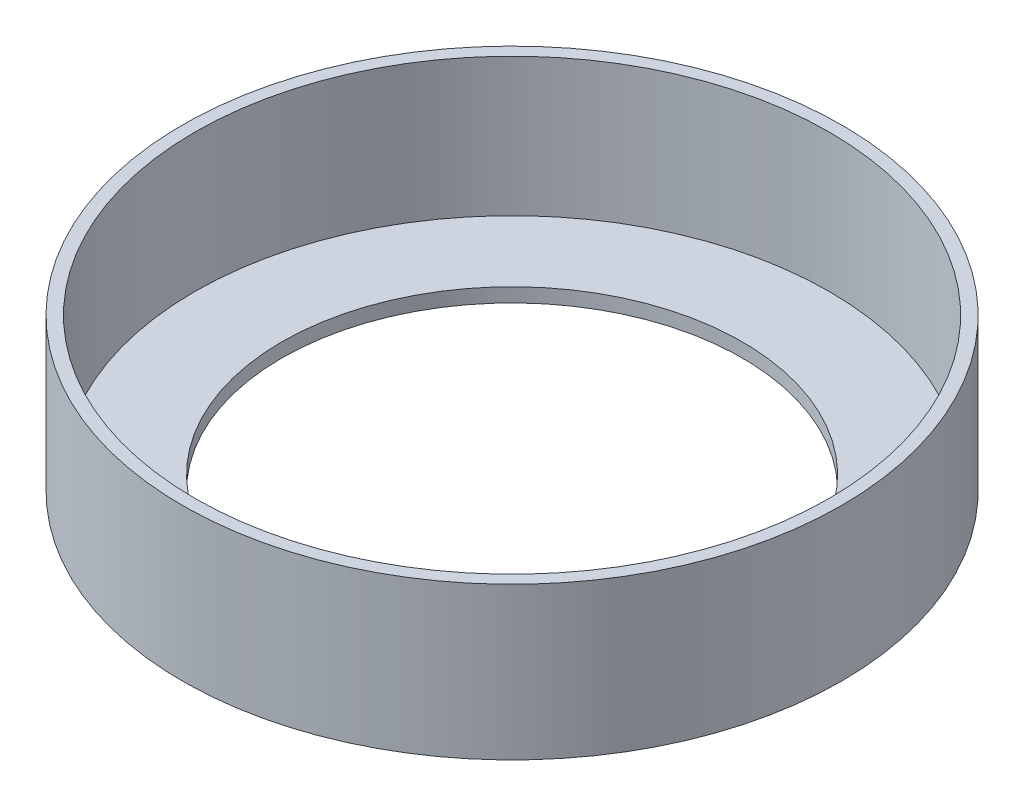
ISO-10303-21;
HEADER;
FILE_DESCRIPTION(('STEP AP214'),'2;1');
FILE_NAME('part.step','',(''),(''),'','','');
FILE_SCHEMA(('AUTOMOTIVE_DESIGN { 1 0 10303 214 1 1 1 1 }'));
ENDSEC;
DATA;
#1=APPLICATION_CONTEXT('core data for automotive mechanical design processes');
#2=APPLICATION_PROTOCOL_DEFINITION('international standard','automotive_design',2000,#1);
#3=PRODUCT_CONTEXT('',#1,'mechanical');
#4=PRODUCT('Part','Part','',(#3));
#5=PRODUCT_RELATED_PRODUCT_CATEGORY('part','',(#4));
#6=PRODUCT_DEFINITION_FORMATION('','',#4);
#7=PRODUCT_DEFINITION_CONTEXT('part definition',#1,'design');
#8=PRODUCT_DEFINITION('design','',#6,#7);
#9=PRODUCT_DEFINITION_SHAPE('','',#8);
#10=(LENGTH_UNIT() NAMED_UNIT(*) SI_UNIT(.MILLI.,.METRE.));
#11=(NAMED_UNIT(*) PLANE_ANGLE_UNIT() SI_UNIT($,.RADIAN.));
#12=(NAMED_UNIT(*) SI_UNIT($,.STERADIAN.) SOLID_ANGLE_UNIT());
#13=UNCERTAINTY_MEASURE_WITH_UNIT(LENGTH_MEASURE(1.E-05),#10,'distance_accuracy_value','');
#14=(GEOMETRIC_REPRESENTATION_CONTEXT(3) GLOBAL_UNCERTAINTY_ASSIGNED_CONTEXT((#13)) GLOBAL_UNIT_ASSIGNED_CONTEXT((#10,
#11,#12)) REPRESENTATION_CONTEXT('',''));
#15=CARTESIAN_POINT('',(0.,0.,0.));
#16=DIRECTION('',(0.,0.,1.));
#17=DIRECTION('',(1.,0.,0.));
#18=AXIS2_PLACEMENT_3D('',#15,#16,#17);
#19=CARTESIAN_POINT('',(0.,24.6,0.));
#20=DIRECTION('',(0.,-1.,0.));
#21=DIRECTION('',(-1.,0.,0.));
#22=AXIS2_PLACEMENT_3D('',#19,#20,#21);
#23=CYLINDRICAL_SURFACE('',#22,56.5);
#24=CARTESIAN_POINT('',(0.,24.6,0.));
#25=DIRECTION('',(0.,1.,0.));
#26=DIRECTION('',(1.,0.,0.));
#27=AXIS2_PLACEMENT_3D('',#24,#25,#26);
#28=CIRCLE('',#27,56.5);
#29=CARTESIAN_POINT('',(56.5,24.6,0.));
#30=VERTEX_POINT('',#29);
#31=EDGE_CURVE('E10',#30,#30,#28,.T.);
#32=ORIENTED_EDGE('',*,*,#31,.T.);
#33=EDGE_LOOP('',(#32));
#34=FACE_BOUND('',#33,.T.);
#35=CARTESIAN_POINT('',(0.,0.,0.));
#36=DIRECTION('',(0.,1.,0.));
#37=DIRECTION('',(1.,0.,0.));
#38=AXIS2_PLACEMENT_3D('',#35,#36,#37);
#39=CIRCLE('',#38,56.5);
#40=CARTESIAN_POINT('',(56.5,0.,0.));
#41=VERTEX_POINT('',#40);
#42=EDGE_CURVE('E21',#41,#41,#39,.T.);
#43=ORIENTED_EDGE('',*,*,#42,.F.);
#44=EDGE_LOOP('',(#43));
#45=FACE_BOUND('',#44,.T.);
#46=ADVANCED_FACE('F15',(#34,#45),#23,.F.);
#47=CARTESIAN_POINT('',(0.,24.6,0.));
#48=DIRECTION('',(0.,-1.,0.));
#49=DIRECTION('',(-1.,0.,0.));
#50=AXIS2_PLACEMENT_3D('',#47,#48,#49);
#51=CYLINDRICAL_SURFACE('',#50,58.7);
#52=CARTESIAN_POINT('',(0.,24.6,0.));
#53=DIRECTION('',(0.,1.,0.));
#54=DIRECTION('',(1.,0.,0.));
#55=AXIS2_PLACEMENT_3D('',#52,#53,#54);
#56=CIRCLE('',#55,58.7);
#57=CARTESIAN_POINT('',(58.7,24.6,0.));
#58=VERTEX_POINT('',#57);
#59=EDGE_CURVE('E25',#58,#58,#56,.T.);
#60=ORIENTED_EDGE('',*,*,#59,.F.);
#61=EDGE_LOOP('',(#60));
#62=FACE_BOUND('',#61,.T.);
#63=CARTESIAN_POINT('',(0.,-2.5,0.));
#64=DIRECTION('',(0.,1.,0.));
#65=DIRECTION('',(1.,0.,0.));
#66=AXIS2_PLACEMENT_3D('',#63,#64,#65);
#67=CIRCLE('',#66,58.7);
#68=CARTESIAN_POINT('',(58.7,-2.5,0.));
#69=VERTEX_POINT('',#68);
#70=EDGE_CURVE('E29',#69,#69,#67,.T.);
#71=ORIENTED_EDGE('',*,*,#70,.T.);
#72=EDGE_LOOP('',(#71));
#73=FACE_BOUND('',#72,.T.);
#74=ADVANCED_FACE('F58',(#62,#73),#51,.T.);
#75=CARTESIAN_POINT('',(0.,24.6,0.));
#76=DIRECTION('',(0.,1.,0.));
#77=DIRECTION('',(1.,0.,0.));
#78=AXIS2_PLACEMENT_3D('',#75,#76,#77);
#79=PLANE('',#78);
#80=ORIENTED_EDGE('',*,*,#31,.F.);
#81=EDGE_LOOP('',(#80));
#82=FACE_BOUND('',#81,.T.);
#83=ORIENTED_EDGE('',*,*,#59,.T.);
#84=EDGE_LOOP('',(#83));
#85=FACE_BOUND('',#84,.T.);
#86=ADVANCED_FACE('F52',(#82,#85),#79,.T.);
#87=CARTESIAN_POINT('',(0.,0.,0.));
#88=DIRECTION('',(0.,1.,0.));
#89=DIRECTION('',(1.,0.,0.));
#90=AXIS2_PLACEMENT_3D('',#87,#88,#89);
#91=PLANE('',#90);
#92=CARTESIAN_POINT('',(0.,0.,0.));
#93=DIRECTION('',(0.,1.,0.));
#94=DIRECTION('',(1.,0.,0.));
#95=AXIS2_PLACEMENT_3D('',#92,#93,#94);
#96=CIRCLE('',#95,41.);
#97=CARTESIAN_POINT('',(41.,0.,0.));
#98=VERTEX_POINT('',#97);
#99=EDGE_CURVE('E34',#98,#98,#96,.T.);
#100=ORIENTED_EDGE('',*,*,#99,.F.);
#101=EDGE_LOOP('',(#100));
#102=FACE_BOUND('',#101,.T.);
#103=ORIENTED_EDGE('',*,*,#42,.T.);
#104=EDGE_LOOP('',(#103));
#105=FACE_BOUND('',#104,.T.);
#106=ADVANCED_FACE('F47',(#102,#105),#91,.T.);
#107=CARTESIAN_POINT('',(0.,-2.5,0.));
#108=DIRECTION('',(0.,1.,0.));
#109=DIRECTION('',(1.,0.,0.));
#110=AXIS2_PLACEMENT_3D('',#107,#108,#109);
#111=CYLINDRICAL_SURFACE('',#110,41.);
#112=CARTESIAN_POINT('',(0.,-2.5,0.));
#113=DIRECTION('',(0.,1.,0.));
#114=DIRECTION('',(1.,0.,0.));
#115=AXIS2_PLACEMENT_3D('',#112,#113,#114);
#116=CIRCLE('',#115,41.);
#117=CARTESIAN_POINT('',(41.,-2.5,0.));
#118=VERTEX_POINT('',#117);
#119=EDGE_CURVE('E37',#118,#118,#116,.T.);
#120=ORIENTED_EDGE('',*,*,#119,.F.);
#121=EDGE_LOOP('',(#120));
#122=FACE_BOUND('',#121,.T.);
#123=ORIENTED_EDGE('',*,*,#99,.T.);
#124=EDGE_LOOP('',(#123));
#125=FACE_BOUND('',#124,.T.);
#126=ADVANCED_FACE('F44',(#122,#125),#111,.F.);
#127=CARTESIAN_POINT('',(0.,-2.5,0.));
#128=DIRECTION('',(0.,1.,0.));
#129=DIRECTION('',(1.,0.,0.));
#130=AXIS2_PLACEMENT_3D('',#127,#128,#129);
#131=PLANE('',#130);
#132=ORIENTED_EDGE('',*,*,#119,.T.);
#133=EDGE_LOOP('',(#132));
#134=FACE_BOUND('',#133,.T.);
#135=ORIENTED_EDGE('',*,*,#70,.F.);
#136=EDGE_LOOP('',(#135));
#137=FACE_BOUND('',#136,.T.);
#138=ADVANCED_FACE('F41',(#134,#137),#131,.F.);
#139=CLOSED_SHELL('',(#46,#74,#86,#106,#126,#138));
#140=MANIFOLD_SOLID_BREP('B1',#139);
#141=ADVANCED_BREP_SHAPE_REPRESENTATION('',(#18,#140),#14);
#142=SHAPE_DEFINITION_REPRESENTATION(#9,#141);
ENDSEC;
END-ISO-10303-21;
